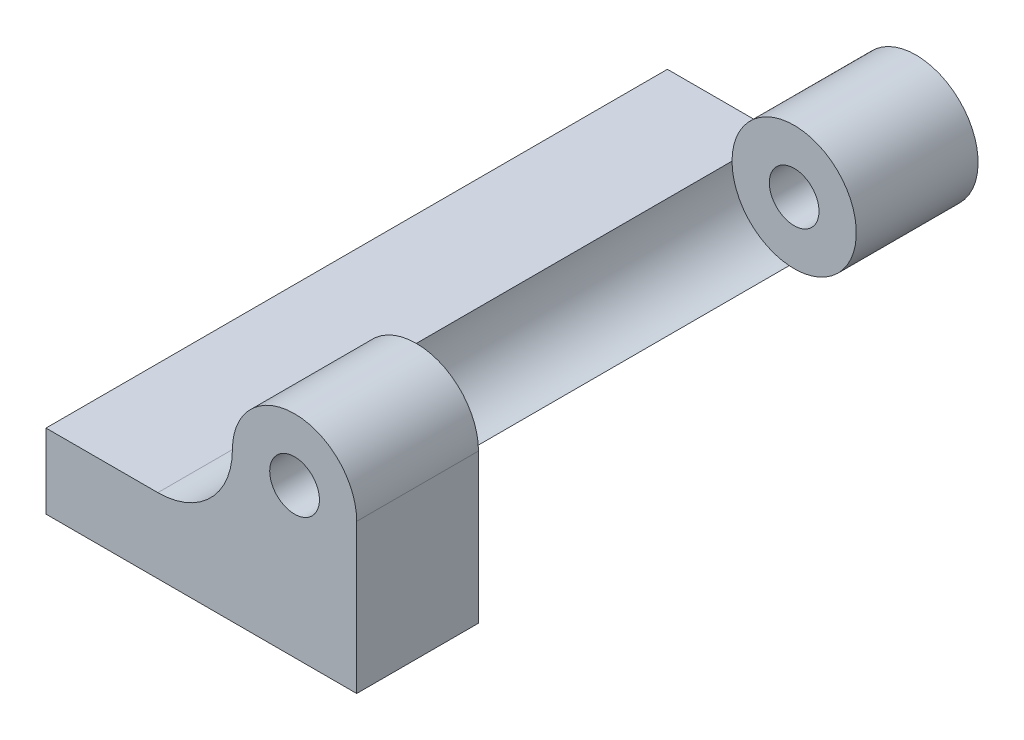
ISO-10303-21;
HEADER;
FILE_DESCRIPTION(('STEP AP214'),'2;1');
FILE_NAME('part.step','',(''),(''),'','','');
FILE_SCHEMA(('AUTOMOTIVE_DESIGN { 1 0 10303 214 1 1 1 1 }'));
ENDSEC;
DATA;
#1=APPLICATION_CONTEXT('core data for automotive mechanical design processes');
#2=APPLICATION_PROTOCOL_DEFINITION('international standard','automotive_design',2000,#1);
#3=PRODUCT_CONTEXT('',#1,'mechanical');
#4=PRODUCT('Part','Part','',(#3));
#5=PRODUCT_RELATED_PRODUCT_CATEGORY('part','',(#4));
#6=PRODUCT_DEFINITION_FORMATION('','',#4);
#7=PRODUCT_DEFINITION_CONTEXT('part definition',#1,'design');
#8=PRODUCT_DEFINITION('design','',#6,#7);
#9=PRODUCT_DEFINITION_SHAPE('','',#8);
#10=(LENGTH_UNIT() NAMED_UNIT(*) SI_UNIT(.MILLI.,.METRE.));
#11=(NAMED_UNIT(*) PLANE_ANGLE_UNIT() SI_UNIT($,.RADIAN.));
#12=(NAMED_UNIT(*) SI_UNIT($,.STERADIAN.) SOLID_ANGLE_UNIT());
#13=UNCERTAINTY_MEASURE_WITH_UNIT(LENGTH_MEASURE(1.E-05),#10,'distance_accuracy_value','');
#14=(GEOMETRIC_REPRESENTATION_CONTEXT(3) GLOBAL_UNCERTAINTY_ASSIGNED_CONTEXT((#13)) GLOBAL_UNIT_ASSIGNED_CONTEXT((#10,
#11,#12)) REPRESENTATION_CONTEXT('',''));
#15=CARTESIAN_POINT('',(0.,0.,0.));
#16=DIRECTION('',(0.,0.,1.));
#17=DIRECTION('',(1.,0.,0.));
#18=AXIS2_PLACEMENT_3D('',#15,#16,#17);
#19=CARTESIAN_POINT('',(7.,4.5,25.));
#20=DIRECTION('',(0.,0.,-1.));
#21=DIRECTION('',(-1.,0.,0.));
#22=AXIS2_PLACEMENT_3D('',#19,#20,#21);
#23=CYLINDRICAL_SURFACE('',#22,2.5);
#24=CARTESIAN_POINT('',(7.,4.5,25.));
#25=DIRECTION('',(0.,0.,1.));
#26=DIRECTION('',(1.,0.,0.));
#27=AXIS2_PLACEMENT_3D('',#24,#25,#26);
#28=CIRCLE('',#27,2.5);
#29=CARTESIAN_POINT('',(9.5,4.5,25.));
#30=VERTEX_POINT('',#29);
#31=CARTESIAN_POINT('',(4.5,4.5,25.));
#32=VERTEX_POINT('',#31);
#33=EDGE_CURVE('E170',#30,#32,#28,.T.);
#34=ORIENTED_EDGE('',*,*,#33,.F.);
#35=DIRECTION('',(0.,0.,1.));
#36=VECTOR('',#35,1.);
#37=CARTESIAN_POINT('',(9.5,4.5,20.1));
#38=LINE('',#37,#36);
#39=CARTESIAN_POINT('',(9.5,4.5,20.1));
#40=VERTEX_POINT('',#39);
#41=EDGE_CURVE('E219',#40,#30,#38,.T.);
#42=ORIENTED_EDGE('',*,*,#41,.F.);
#43=CARTESIAN_POINT('',(7.,4.5,20.1));
#44=DIRECTION('',(0.,0.,-1.));
#45=DIRECTION('',(-1.,0.,0.));
#46=AXIS2_PLACEMENT_3D('',#43,#44,#45);
#47=CIRCLE('',#46,2.5);
#48=CARTESIAN_POINT('',(4.5,4.5,20.1));
#49=VERTEX_POINT('',#48);
#50=EDGE_CURVE('E149',#49,#40,#47,.T.);
#51=ORIENTED_EDGE('',*,*,#50,.F.);
#52=DIRECTION('',(0.,0.,-1.));
#53=VECTOR('',#52,1.);
#54=CARTESIAN_POINT('',(4.5,4.5,25.));
#55=LINE('',#54,#53);
#56=EDGE_CURVE('E144',#32,#49,#55,.T.);
#57=ORIENTED_EDGE('',*,*,#56,.F.);
#58=EDGE_LOOP('',(#34,#42,#51,#57));
#59=FACE_BOUND('',#58,.T.);
#60=ADVANCED_FACE('F35',(#59),#23,.T.);
#61=CARTESIAN_POINT('',(7.,4.5,25.));
#62=DIRECTION('',(0.,0.,-1.));
#63=DIRECTION('',(-1.,0.,0.));
#64=AXIS2_PLACEMENT_3D('',#61,#62,#63);
#65=CYLINDRICAL_SURFACE('',#64,1.);
#66=CARTESIAN_POINT('',(7.,4.5,25.));
#67=DIRECTION('',(0.,0.,1.));
#68=DIRECTION('',(1.,0.,0.));
#69=AXIS2_PLACEMENT_3D('',#66,#67,#68);
#70=CIRCLE('',#69,1.);
#71=CARTESIAN_POINT('',(8.,4.5,25.));
#72=VERTEX_POINT('',#71);
#73=EDGE_CURVE('E161',#72,#72,#70,.T.);
#74=ORIENTED_EDGE('',*,*,#73,.T.);
#75=EDGE_LOOP('',(#74));
#76=FACE_BOUND('',#75,.T.);
#77=CARTESIAN_POINT('',(7.,4.5,20.1));
#78=DIRECTION('',(0.,0.,-1.));
#79=DIRECTION('',(-1.,0.,0.));
#80=AXIS2_PLACEMENT_3D('',#77,#78,#79);
#81=CIRCLE('',#80,1.);
#82=CARTESIAN_POINT('',(6.,4.5,20.1));
#83=VERTEX_POINT('',#82);
#84=EDGE_CURVE('E39',#83,#83,#81,.T.);
#85=ORIENTED_EDGE('',*,*,#84,.T.);
#86=EDGE_LOOP('',(#85));
#87=FACE_BOUND('',#86,.T.);
#88=ADVANCED_FACE('F235',(#76,#87),#65,.F.);
#89=CARTESIAN_POINT('',(1.5,4.5,25.));
#90=DIRECTION('',(0.,0.,-1.));
#91=DIRECTION('',(-1.,0.,0.));
#92=AXIS2_PLACEMENT_3D('',#89,#90,#91);
#93=PLANE('',#92);
#94=DIRECTION('',(0.,1.,0.));
#95=VECTOR('',#94,1.);
#96=CARTESIAN_POINT('',(9.5,-1.5,25.));
#97=LINE('',#96,#95);
#98=CARTESIAN_POINT('',(9.5,-1.5,25.));
#99=VERTEX_POINT('',#98);
#100=EDGE_CURVE('E137',#99,#30,#97,.T.);
#101=ORIENTED_EDGE('',*,*,#100,.T.);
#102=ORIENTED_EDGE('',*,*,#33,.T.);
#103=CARTESIAN_POINT('',(1.5,4.5,25.));
#104=DIRECTION('',(0.,0.,-1.));
#105=DIRECTION('',(-1.,0.,0.));
#106=AXIS2_PLACEMENT_3D('',#103,#104,#105);
#107=CIRCLE('',#106,3.);
#108=CARTESIAN_POINT('',(1.5,1.5,25.));
#109=VERTEX_POINT('',#108);
#110=EDGE_CURVE('E172',#32,#109,#107,.T.);
#111=ORIENTED_EDGE('',*,*,#110,.T.);
#112=DIRECTION('',(-1.,0.,0.));
#113=VECTOR('',#112,1.);
#114=CARTESIAN_POINT('',(-3.,1.5,25.));
#115=LINE('',#114,#113);
#116=CARTESIAN_POINT('',(-3.,1.5,25.));
#117=VERTEX_POINT('',#116);
#118=EDGE_CURVE('E61',#109,#117,#115,.T.);
#119=ORIENTED_EDGE('',*,*,#118,.T.);
#120=DIRECTION('',(0.,-1.,0.));
#121=VECTOR('',#120,1.);
#122=CARTESIAN_POINT('',(-3.,-1.5,25.));
#123=LINE('',#122,#121);
#124=CARTESIAN_POINT('',(-3.,-1.5,25.));
#125=VERTEX_POINT('',#124);
#126=EDGE_CURVE('E167',#117,#125,#123,.T.);
#127=ORIENTED_EDGE('',*,*,#126,.T.);
#128=DIRECTION('',(1.,0.,0.));
#129=VECTOR('',#128,1.);
#130=CARTESIAN_POINT('',(-3.,-1.5,25.));
#131=LINE('',#130,#129);
#132=EDGE_CURVE('E95',#125,#99,#131,.T.);
#133=ORIENTED_EDGE('',*,*,#132,.T.);
#134=EDGE_LOOP('',(#101,#102,#111,#119,#127,#133));
#135=FACE_BOUND('',#134,.T.);
#136=ORIENTED_EDGE('',*,*,#73,.F.);
#137=EDGE_LOOP('',(#136));
#138=FACE_BOUND('',#137,.T.);
#139=ADVANCED_FACE('F213',(#135,#138),#93,.F.);
#140=CARTESIAN_POINT('',(1.5,4.5,0.));
#141=DIRECTION('',(0.,0.,-1.));
#142=DIRECTION('',(-1.,0.,0.));
#143=AXIS2_PLACEMENT_3D('',#140,#141,#142);
#144=PLANE('',#143);
#145=DIRECTION('',(0.,-1.,0.));
#146=VECTOR('',#145,1.);
#147=CARTESIAN_POINT('',(-3.,-1.5,0.));
#148=LINE('',#147,#146);
#149=CARTESIAN_POINT('',(-3.,1.5,0.));
#150=VERTEX_POINT('',#149);
#151=CARTESIAN_POINT('',(-3.,-1.5,0.));
#152=VERTEX_POINT('',#151);
#153=EDGE_CURVE('E164',#150,#152,#148,.T.);
#154=ORIENTED_EDGE('',*,*,#153,.F.);
#155=DIRECTION('',(-1.,0.,0.));
#156=VECTOR('',#155,1.);
#157=CARTESIAN_POINT('',(-3.,1.5,0.));
#158=LINE('',#157,#156);
#159=CARTESIAN_POINT('',(1.5,1.5,0.));
#160=VERTEX_POINT('',#159);
#161=EDGE_CURVE('E88',#160,#150,#158,.T.);
#162=ORIENTED_EDGE('',*,*,#161,.F.);
#163=CARTESIAN_POINT('',(1.5,4.5,0.));
#164=DIRECTION('',(0.,0.,-1.));
#165=DIRECTION('',(-1.,0.,0.));
#166=AXIS2_PLACEMENT_3D('',#163,#164,#165);
#167=CIRCLE('',#166,3.);
#168=CARTESIAN_POINT('',(4.5,4.5,0.));
#169=VERTEX_POINT('',#168);
#170=EDGE_CURVE('E184',#169,#160,#167,.T.);
#171=ORIENTED_EDGE('',*,*,#170,.F.);
#172=CARTESIAN_POINT('',(7.,4.5,0.));
#173=DIRECTION('',(0.,0.,1.));
#174=DIRECTION('',(1.,0.,0.));
#175=AXIS2_PLACEMENT_3D('',#172,#173,#174);
#176=CIRCLE('',#175,2.5);
#177=CARTESIAN_POINT('',(6.80031948881789,2.00798722044728,0.));
#178=VERTEX_POINT('',#177);
#179=EDGE_CURVE('E181',#178,#169,#176,.T.);
#180=ORIENTED_EDGE('',*,*,#179,.F.);
#181=CARTESIAN_POINT('',(6.51923076923077,-1.5,0.));
#182=DIRECTION('',(0.,0.,-1.));
#183=DIRECTION('',(1.,0.,0.));
#184=AXIS2_PLACEMENT_3D('',#181,#182,#183);
#185=CIRCLE('',#184,3.51923076923077);
#186=CARTESIAN_POINT('',(3.,-1.5,0.));
#187=VERTEX_POINT('',#186);
#188=EDGE_CURVE('E179',#187,#178,#185,.T.);
#189=ORIENTED_EDGE('',*,*,#188,.F.);
#190=DIRECTION('',(1.,0.,0.));
#191=VECTOR('',#190,1.);
#192=CARTESIAN_POINT('',(-3.,-1.5,0.));
#193=LINE('',#192,#191);
#194=EDGE_CURVE('E140',#152,#187,#193,.T.);
#195=ORIENTED_EDGE('',*,*,#194,.F.);
#196=EDGE_LOOP('',(#154,#162,#171,#180,#189,#195));
#197=FACE_BOUND('',#196,.T.);
#198=CARTESIAN_POINT('',(7.,4.5,0.));
#199=DIRECTION('',(0.,0.,1.));
#200=DIRECTION('',(1.,0.,0.));
#201=AXIS2_PLACEMENT_3D('',#198,#199,#200);
#202=CIRCLE('',#201,1.);
#203=CARTESIAN_POINT('',(8.,4.5,0.));
#204=VERTEX_POINT('',#203);
#205=EDGE_CURVE('E160',#204,#204,#202,.T.);
#206=ORIENTED_EDGE('',*,*,#205,.T.);
#207=EDGE_LOOP('',(#206));
#208=FACE_BOUND('',#207,.T.);
#209=ADVANCED_FACE('F206',(#197,#208),#144,.T.);
#210=CARTESIAN_POINT('',(-3.,-1.5,25.));
#211=DIRECTION('',(1.,0.,0.));
#212=DIRECTION('',(0.,0.,-1.));
#213=AXIS2_PLACEMENT_3D('',#210,#211,#212);
#214=PLANE('',#213);
#215=ORIENTED_EDGE('',*,*,#153,.T.);
#216=DIRECTION('',(0.,0.,-1.));
#217=VECTOR('',#216,1.);
#218=CARTESIAN_POINT('',(-3.,-1.5,25.));
#219=LINE('',#218,#217);
#220=EDGE_CURVE('E12',#125,#152,#219,.T.);
#221=ORIENTED_EDGE('',*,*,#220,.F.);
#222=ORIENTED_EDGE('',*,*,#126,.F.);
#223=DIRECTION('',(0.,0.,-1.));
#224=VECTOR('',#223,1.);
#225=CARTESIAN_POINT('',(-3.,1.5,25.));
#226=LINE('',#225,#224);
#227=EDGE_CURVE('E175',#117,#150,#226,.T.);
#228=ORIENTED_EDGE('',*,*,#227,.T.);
#229=EDGE_LOOP('',(#215,#221,#222,#228));
#230=FACE_BOUND('',#229,.T.);
#231=ADVANCED_FACE('F37',(#230),#214,.F.);
#232=CARTESIAN_POINT('',(-3.,-1.5,25.));
#233=DIRECTION('',(0.,1.,0.));
#234=DIRECTION('',(0.,0.,1.));
#235=AXIS2_PLACEMENT_3D('',#232,#233,#234);
#236=PLANE('',#235);
#237=ORIENTED_EDGE('',*,*,#194,.T.);
#238=DIRECTION('',(0.,0.,-1.));
#239=VECTOR('',#238,1.);
#240=CARTESIAN_POINT('',(3.,-1.5,25.));
#241=LINE('',#240,#239);
#242=CARTESIAN_POINT('',(3.,-1.5,20.1));
#243=VERTEX_POINT('',#242);
#244=EDGE_CURVE('E44',#243,#187,#241,.T.);
#245=ORIENTED_EDGE('',*,*,#244,.F.);
#246=DIRECTION('',(1.,0.,0.));
#247=VECTOR('',#246,1.);
#248=CARTESIAN_POINT('',(3.,-1.5,20.1));
#249=LINE('',#248,#247);
#250=CARTESIAN_POINT('',(9.5,-1.5,20.1));
#251=VERTEX_POINT('',#250);
#252=EDGE_CURVE('E120',#243,#251,#249,.T.);
#253=ORIENTED_EDGE('',*,*,#252,.T.);
#254=DIRECTION('',(0.,0.,1.));
#255=VECTOR('',#254,1.);
#256=CARTESIAN_POINT('',(9.5,-1.5,20.1));
#257=LINE('',#256,#255);
#258=EDGE_CURVE('E222',#251,#99,#257,.T.);
#259=ORIENTED_EDGE('',*,*,#258,.T.);
#260=ORIENTED_EDGE('',*,*,#132,.F.);
#261=ORIENTED_EDGE('',*,*,#220,.T.);
#262=EDGE_LOOP('',(#237,#245,#253,#259,#260,#261));
#263=FACE_BOUND('',#262,.T.);
#264=ADVANCED_FACE('F139',(#263),#236,.F.);
#265=CARTESIAN_POINT('',(6.51923076923077,-1.5,25.));
#266=DIRECTION('',(0.,0.,-1.));
#267=DIRECTION('',(-1.,0.,0.));
#268=AXIS2_PLACEMENT_3D('',#265,#266,#267);
#269=CYLINDRICAL_SURFACE('',#268,3.51923076923077);
#270=DIRECTION('',(0.,0.,-1.));
#271=VECTOR('',#270,1.);
#272=CARTESIAN_POINT('',(6.80031948881789,2.00798722044728,12.5));
#273=LINE('',#272,#271);
#274=CARTESIAN_POINT('',(6.80031948881789,2.00798722044728,20.1));
#275=VERTEX_POINT('',#274);
#276=CARTESIAN_POINT('',(6.80031948881789,2.00798722044728,4.9));
#277=VERTEX_POINT('',#276);
#278=EDGE_CURVE('E136',#275,#277,#273,.T.);
#279=ORIENTED_EDGE('',*,*,#278,.F.);
#280=CARTESIAN_POINT('',(6.51923076923077,-1.5,20.1));
#281=DIRECTION('',(0.,0.,1.));
#282=DIRECTION('',(-1.,0.,0.));
#283=AXIS2_PLACEMENT_3D('',#280,#281,#282);
#284=CIRCLE('',#283,3.51923076923077);
#285=EDGE_CURVE('E125',#275,#243,#284,.T.);
#286=ORIENTED_EDGE('',*,*,#285,.T.);
#287=ORIENTED_EDGE('',*,*,#244,.T.);
#288=ORIENTED_EDGE('',*,*,#188,.T.);
#289=DIRECTION('',(0.,0.,-1.));
#290=VECTOR('',#289,1.);
#291=CARTESIAN_POINT('',(6.80031948881789,2.00798722044728,25.));
#292=LINE('',#291,#290);
#293=EDGE_CURVE('E142',#277,#178,#292,.T.);
#294=ORIENTED_EDGE('',*,*,#293,.F.);
#295=EDGE_LOOP('',(#279,#286,#287,#288,#294));
#296=FACE_BOUND('',#295,.T.);
#297=ADVANCED_FACE('F132',(#296),#269,.F.);
#298=CARTESIAN_POINT('',(4.5,4.5,4.9));
#299=VERTEX_POINT('',#298);
#300=EDGE_CURVE('E189',#299,#169,#55,.T.);
#301=ORIENTED_EDGE('',*,*,#300,.F.);
#302=CARTESIAN_POINT('',(7.,4.5,4.9));
#303=DIRECTION('',(0.,0.,-1.));
#304=DIRECTION('',(-1.,0.,0.));
#305=AXIS2_PLACEMENT_3D('',#302,#303,#304);
#306=CIRCLE('',#305,2.5);
#307=EDGE_CURVE('E221',#277,#299,#306,.F.);
#308=ORIENTED_EDGE('',*,*,#307,.F.);
#309=ORIENTED_EDGE('',*,*,#293,.T.);
#310=ORIENTED_EDGE('',*,*,#179,.T.);
#311=EDGE_LOOP('',(#301,#308,#309,#310));
#312=FACE_BOUND('',#311,.T.);
#313=ADVANCED_FACE('F203',(#312),#23,.T.);
#314=CARTESIAN_POINT('',(1.5,4.5,25.));
#315=DIRECTION('',(0.,0.,-1.));
#316=DIRECTION('',(-1.,0.,0.));
#317=AXIS2_PLACEMENT_3D('',#314,#315,#316);
#318=CYLINDRICAL_SURFACE('',#317,3.);
#319=ORIENTED_EDGE('',*,*,#170,.T.);
#320=DIRECTION('',(0.,0.,-1.));
#321=VECTOR('',#320,1.);
#322=CARTESIAN_POINT('',(1.5,1.5,25.));
#323=LINE('',#322,#321);
#324=EDGE_CURVE('E188',#109,#160,#323,.T.);
#325=ORIENTED_EDGE('',*,*,#324,.F.);
#326=ORIENTED_EDGE('',*,*,#110,.F.);
#327=ORIENTED_EDGE('',*,*,#56,.T.);
#328=EDGE_CURVE('E191',#49,#299,#55,.T.);
#329=ORIENTED_EDGE('',*,*,#328,.T.);
#330=ORIENTED_EDGE('',*,*,#300,.T.);
#331=EDGE_LOOP('',(#319,#325,#326,#327,#329,#330));
#332=FACE_BOUND('',#331,.T.);
#333=ADVANCED_FACE('F197',(#332),#318,.F.);
#334=CARTESIAN_POINT('',(-3.,1.5,25.));
#335=DIRECTION('',(0.,-1.,0.));
#336=DIRECTION('',(0.,0.,-1.));
#337=AXIS2_PLACEMENT_3D('',#334,#335,#336);
#338=PLANE('',#337);
#339=ORIENTED_EDGE('',*,*,#161,.T.);
#340=ORIENTED_EDGE('',*,*,#227,.F.);
#341=ORIENTED_EDGE('',*,*,#118,.F.);
#342=ORIENTED_EDGE('',*,*,#324,.T.);
#343=EDGE_LOOP('',(#339,#340,#341,#342));
#344=FACE_BOUND('',#343,.T.);
#345=ADVANCED_FACE('F211',(#344),#338,.F.);
#346=CARTESIAN_POINT('',(7.,4.5,4.9));
#347=DIRECTION('',(0.,0.,-1.));
#348=DIRECTION('',(-1.,0.,0.));
#349=AXIS2_PLACEMENT_3D('',#346,#347,#348);
#350=CIRCLE('',#349,1.);
#351=CARTESIAN_POINT('',(6.,4.5,4.9));
#352=VERTEX_POINT('',#351);
#353=EDGE_CURVE('E147',#352,#352,#350,.T.);
#354=ORIENTED_EDGE('',*,*,#353,.F.);
#355=EDGE_LOOP('',(#354));
#356=FACE_BOUND('',#355,.T.);
#357=ORIENTED_EDGE('',*,*,#205,.F.);
#358=EDGE_LOOP('',(#357));
#359=FACE_BOUND('',#358,.T.);
#360=ADVANCED_FACE('F242',(#356,#359),#65,.F.);
#361=CARTESIAN_POINT('',(7.,4.5,32.0710678118655));
#362=DIRECTION('',(0.,0.,-1.));
#363=DIRECTION('',(-1.,0.,0.));
#364=AXIS2_PLACEMENT_3D('',#361,#362,#363);
#365=CYLINDRICAL_SURFACE('',#364,2.5);
#366=ORIENTED_EDGE('',*,*,#278,.T.);
#367=EDGE_CURVE('E52',#299,#277,#306,.F.);
#368=ORIENTED_EDGE('',*,*,#367,.F.);
#369=ORIENTED_EDGE('',*,*,#328,.F.);
#370=EDGE_CURVE('E153',#275,#49,#47,.T.);
#371=ORIENTED_EDGE('',*,*,#370,.F.);
#372=EDGE_LOOP('',(#366,#368,#369,#371));
#373=FACE_BOUND('',#372,.T.);
#374=ADVANCED_FACE('F269',(#373),#365,.F.);
#375=CARTESIAN_POINT('',(1.5,4.5,20.1));
#376=DIRECTION('',(0.,0.,-1.));
#377=DIRECTION('',(-1.,0.,0.));
#378=AXIS2_PLACEMENT_3D('',#375,#376,#377);
#379=PLANE('',#378);
#380=ORIENTED_EDGE('',*,*,#84,.F.);
#381=EDGE_LOOP('',(#380));
#382=FACE_BOUND('',#381,.T.);
#383=ORIENTED_EDGE('',*,*,#50,.T.);
#384=DIRECTION('',(0.,1.,0.));
#385=VECTOR('',#384,1.);
#386=CARTESIAN_POINT('',(9.5,-1.5,20.1));
#387=LINE('',#386,#385);
#388=EDGE_CURVE('E127',#251,#40,#387,.T.);
#389=ORIENTED_EDGE('',*,*,#388,.F.);
#390=ORIENTED_EDGE('',*,*,#252,.F.);
#391=ORIENTED_EDGE('',*,*,#285,.F.);
#392=ORIENTED_EDGE('',*,*,#370,.T.);
#393=EDGE_LOOP('',(#383,#389,#390,#391,#392));
#394=FACE_BOUND('',#393,.T.);
#395=ADVANCED_FACE('F123',(#382,#394),#379,.T.);
#396=CARTESIAN_POINT('',(1.5,4.5,4.9));
#397=DIRECTION('',(0.,0.,-1.));
#398=DIRECTION('',(-1.,0.,0.));
#399=AXIS2_PLACEMENT_3D('',#396,#397,#398);
#400=PLANE('',#399);
#401=ORIENTED_EDGE('',*,*,#353,.T.);
#402=EDGE_LOOP('',(#401));
#403=FACE_BOUND('',#402,.T.);
#404=ORIENTED_EDGE('',*,*,#367,.T.);
#405=ORIENTED_EDGE('',*,*,#307,.T.);
#406=EDGE_LOOP('',(#404,#405));
#407=FACE_BOUND('',#406,.T.);
#408=ADVANCED_FACE('F228',(#403,#407),#400,.F.);
#409=CARTESIAN_POINT('',(9.5,-1.5,20.1));
#410=DIRECTION('',(1.,0.,0.));
#411=DIRECTION('',(0.,1.,0.));
#412=AXIS2_PLACEMENT_3D('',#409,#410,#411);
#413=PLANE('',#412);
#414=ORIENTED_EDGE('',*,*,#100,.F.);
#415=ORIENTED_EDGE('',*,*,#258,.F.);
#416=ORIENTED_EDGE('',*,*,#388,.T.);
#417=ORIENTED_EDGE('',*,*,#41,.T.);
#418=EDGE_LOOP('',(#414,#415,#416,#417));
#419=FACE_BOUND('',#418,.T.);
#420=ADVANCED_FACE('F226',(#419),#413,.T.);
#421=CLOSED_SHELL('',(#60,#88,#139,#209,#231,#264,#297,#313,#333,#345,#360,#374,#395,#408,#420));
#422=MANIFOLD_SOLID_BREP('B2',#421);
#423=ADVANCED_BREP_SHAPE_REPRESENTATION('',(#18,#422),#14);
#424=SHAPE_DEFINITION_REPRESENTATION(#9,#423);
ENDSEC;
END-ISO-10303-21;
